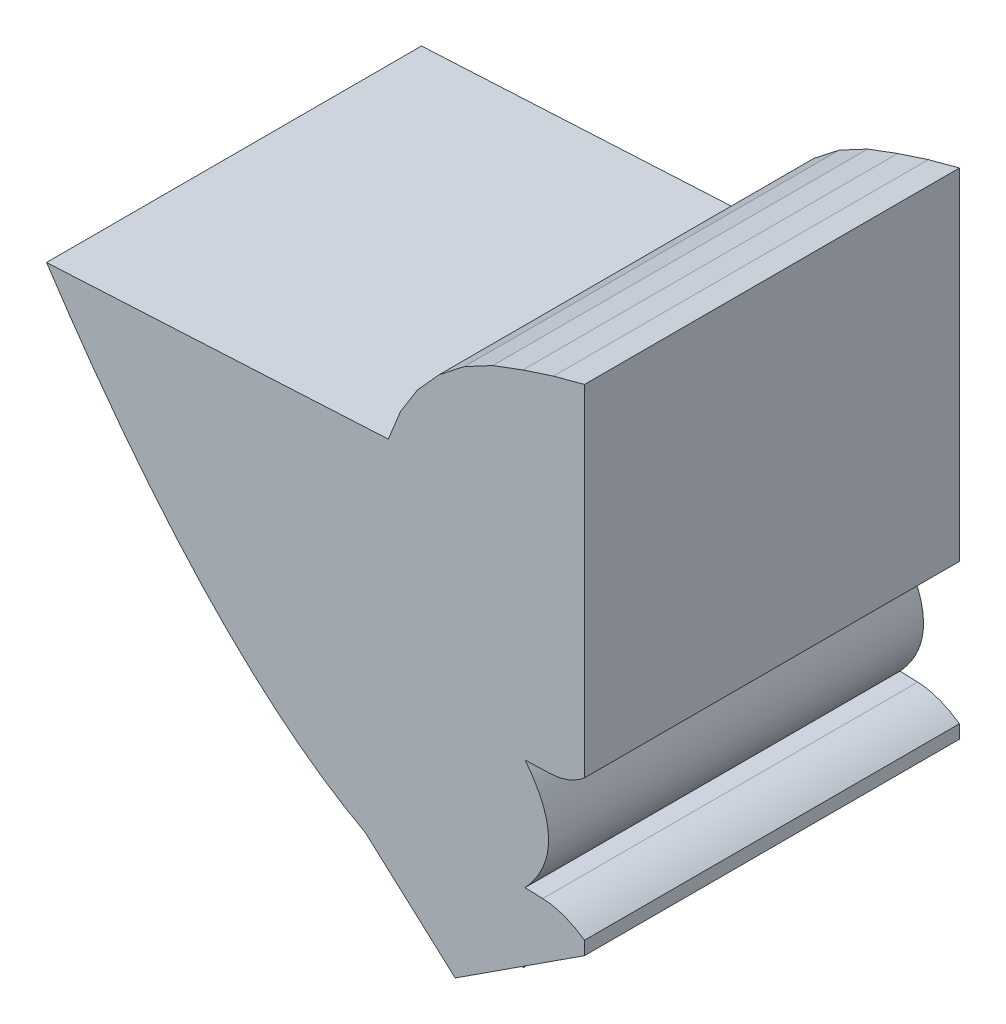
ISO-10303-21;
HEADER;
FILE_DESCRIPTION(('STEP AP214'),'2;1');
FILE_NAME('part.step','',(''),(''),'','','');
FILE_SCHEMA(('AUTOMOTIVE_DESIGN { 1 0 10303 214 1 1 1 1 }'));
ENDSEC;
DATA;
#1=APPLICATION_CONTEXT('core data for automotive mechanical design processes');
#2=APPLICATION_PROTOCOL_DEFINITION('international standard','automotive_design',2000,#1);
#3=PRODUCT_CONTEXT('',#1,'mechanical');
#4=PRODUCT('Part','Part','',(#3));
#5=PRODUCT_RELATED_PRODUCT_CATEGORY('part','',(#4));
#6=PRODUCT_DEFINITION_FORMATION('','',#4);
#7=PRODUCT_DEFINITION_CONTEXT('part definition',#1,'design');
#8=PRODUCT_DEFINITION('design','',#6,#7);
#9=PRODUCT_DEFINITION_SHAPE('','',#8);
#10=(LENGTH_UNIT() NAMED_UNIT(*) SI_UNIT(.MILLI.,.METRE.));
#11=(NAMED_UNIT(*) PLANE_ANGLE_UNIT() SI_UNIT($,.RADIAN.));
#12=(NAMED_UNIT(*) SI_UNIT($,.STERADIAN.) SOLID_ANGLE_UNIT());
#13=UNCERTAINTY_MEASURE_WITH_UNIT(LENGTH_MEASURE(1.E-05),#10,'distance_accuracy_value','');
#14=(GEOMETRIC_REPRESENTATION_CONTEXT(3) GLOBAL_UNCERTAINTY_ASSIGNED_CONTEXT((#13)) GLOBAL_UNIT_ASSIGNED_CONTEXT((#10,
#11,#12)) REPRESENTATION_CONTEXT('',''));
#15=CARTESIAN_POINT('',(0.,0.,0.));
#16=DIRECTION('',(0.,0.,1.));
#17=DIRECTION('',(1.,0.,0.));
#18=AXIS2_PLACEMENT_3D('',#15,#16,#17);
#19=CARTESIAN_POINT('',(-996004.99942647,89338.2959789018,30.7968303069805));
#20=CARTESIAN_POINT('',(996193.448091746,-87155.7427476542,30.7968303069805));
#21=CARTESIAN_POINT('',(-996386.896757022,84973.1895164066,30.7968303069805));
#22=B_SPLINE_CURVE_WITH_KNOTS('',2,(#19,#20,#21),.UNSPECIFIED.,.F.,.F.,(3,3),(0.,1.),.UNSPECIFIED.);
#23=DIRECTION('',(0.,0.,-1.));
#24=VECTOR('',#23,1.);
#25=SURFACE_OF_LINEAR_EXTRUSION('',#22,#24);
#26=CARTESIAN_POINT('',(-996004.99942647,89338.2959789018,6.9937));
#27=CARTESIAN_POINT('',(996193.448091746,-87155.7427476542,6.9937));
#28=CARTESIAN_POINT('',(-996386.896757022,84973.1895164066,6.9937));
#29=B_SPLINE_CURVE_WITH_KNOTS('',2,(#26,#27,#28),.UNSPECIFIED.,.F.,.F.,(3,3),(0.,1.),.UNSPECIFIED.);
#30=CARTESIAN_POINT('',(-2.11351559756429,2.34471545593529,6.9937));
#31=VERTEX_POINT('',#30);
#32=CARTESIAN_POINT('',(-2.11897326832641,-1.77801919491,6.9937));
#33=VERTEX_POINT('',#32);
#34=EDGE_CURVE('E321',#31,#33,#29,.T.);
#35=ORIENTED_EDGE('',*,*,#34,.T.);
#36=DIRECTION('',(0.,0.,-1.));
#37=VECTOR('',#36,1.);
#38=CARTESIAN_POINT('',(-2.11897326731891,-1.77801919494525,0.));
#39=LINE('',#38,#37);
#40=CARTESIAN_POINT('',(-2.11897326832641,-1.77801919491,-6.9937));
#41=VERTEX_POINT('',#40);
#42=EDGE_CURVE('E522',#33,#41,#39,.T.);
#43=ORIENTED_EDGE('',*,*,#42,.T.);
#44=CARTESIAN_POINT('',(-996004.99942647,89338.2959789018,-6.9937));
#45=CARTESIAN_POINT('',(996193.448091746,-87155.7427476542,-6.9937));
#46=CARTESIAN_POINT('',(-996386.896757022,84973.1895164066,-6.9937));
#47=B_SPLINE_CURVE_WITH_KNOTS('',2,(#44,#45,#46),.UNSPECIFIED.,.F.,.F.,(3,3),(0.,1.),.UNSPECIFIED.);
#48=CARTESIAN_POINT('',(-2.11351559802885,2.3447154697661,-6.9937));
#49=VERTEX_POINT('',#48);
#50=EDGE_CURVE('E213',#41,#49,#47,.F.);
#51=ORIENTED_EDGE('',*,*,#50,.T.);
#52=DIRECTION('',(0.,0.,-1.));
#53=VECTOR('',#52,1.);
#54=CARTESIAN_POINT('',(-2.11351560820955,2.34471546941639,0.));
#55=LINE('',#54,#53);
#56=EDGE_CURVE('E479',#49,#31,#55,.F.);
#57=ORIENTED_EDGE('',*,*,#56,.T.);
#58=EDGE_LOOP('',(#35,#43,#51,#57));
#59=FACE_BOUND('',#58,.T.);
#60=ADVANCED_FACE('F59',(#59),#25,.T.);
#61=CARTESIAN_POINT('',(-2.17733041778456,0.,6.9937));
#62=DIRECTION('',(1.,0.,0.));
#63=DIRECTION('',(0.,1.,0.));
#64=AXIS2_PLACEMENT_3D('',#61,#62,#63);
#65=PLANE('',#64);
#66=DIRECTION('',(0.,-1.,0.));
#67=VECTOR('',#66,1.);
#68=CARTESIAN_POINT('',(-2.17733041778456,0.,-6.9937));
#69=LINE('',#68,#67);
#70=CARTESIAN_POINT('',(-2.17733041778456,-4.34672273486103,-6.9937));
#71=VERTEX_POINT('',#70);
#72=CARTESIAN_POINT('',(-2.17733041780011,-4.38828202201252,-6.9937));
#73=VERTEX_POINT('',#72);
#74=EDGE_CURVE('E333',#71,#73,#69,.T.);
#75=ORIENTED_EDGE('',*,*,#74,.F.);
#76=DIRECTION('',(0.,0.,1.));
#77=VECTOR('',#76,1.);
#78=CARTESIAN_POINT('',(-2.17733041778456,-4.34672273486103,6.9937));
#79=LINE('',#78,#77);
#80=CARTESIAN_POINT('',(-2.17733041778456,-4.34672273486103,6.9937));
#81=VERTEX_POINT('',#80);
#82=EDGE_CURVE('E244',#71,#81,#79,.T.);
#83=ORIENTED_EDGE('',*,*,#82,.T.);
#84=DIRECTION('',(0.,-1.,0.));
#85=VECTOR('',#84,1.);
#86=CARTESIAN_POINT('',(-2.17733041778456,0.,6.9937));
#87=LINE('',#86,#85);
#88=CARTESIAN_POINT('',(-2.17733041778456,-4.38828202201252,6.9937));
#89=VERTEX_POINT('',#88);
#90=EDGE_CURVE('E482',#81,#89,#87,.T.);
#91=ORIENTED_EDGE('',*,*,#90,.T.);
#92=DIRECTION('',(0.,0.,1.));
#93=VECTOR('',#92,1.);
#94=CARTESIAN_POINT('',(-2.17733041780011,-4.38828202201252,-6.9937));
#95=LINE('',#94,#93);
#96=EDGE_CURVE('E310',#73,#89,#95,.T.);
#97=ORIENTED_EDGE('',*,*,#96,.F.);
#98=EDGE_LOOP('',(#75,#83,#91,#97));
#99=FACE_BOUND('',#98,.T.);
#100=ADVANCED_FACE('F58',(#99),#65,.T.);
#101=CARTESIAN_POINT('',(-82931.2998220372,996560.090302793,30.7968303069805));
#102=CARTESIAN_POINT('',(87153.689514863,-996199.076380996,30.7968303069805));
#103=CARTESIAN_POINT('',(-91384.2921388703,995820.549302198,30.7968303069805));
#104=B_SPLINE_CURVE_WITH_KNOTS('',2,(#101,#102,#103),.UNSPECIFIED.,.F.,.F.,(3,3),(0.,1.),.UNSPECIFIED.);
#105=DIRECTION('',(0.,0.,-1.));
#106=VECTOR('',#105,1.);
#107=SURFACE_OF_LINEAR_EXTRUSION('',#104,#106);
#108=CARTESIAN_POINT('',(-82931.2998220372,996560.090302793,-6.9937));
#109=CARTESIAN_POINT('',(87153.689514863,-996199.076380996,-6.9937));
#110=CARTESIAN_POINT('',(-91384.2921388703,995820.549302198,-6.9937));
#111=B_SPLINE_CURVE_WITH_KNOTS('',2,(#108,#109,#110),.UNSPECIFIED.,.F.,.F.,(3,3),(0.,1.),.UNSPECIFIED.);
#112=CARTESIAN_POINT('',(-19.9693590135837,9.49376503209609,-6.9937));
#113=VERTEX_POINT('',#112);
#114=CARTESIAN_POINT('',(-8.08311431531605,-2.9746782819303,-6.9937));
#115=VERTEX_POINT('',#114);
#116=EDGE_CURVE('E317',#113,#115,#111,.F.);
#117=ORIENTED_EDGE('',*,*,#116,.T.);
#118=DIRECTION('',(0.,0.,-1.));
#119=VECTOR('',#118,1.);
#120=CARTESIAN_POINT('',(-8.08311437413045,-2.97467822900344,0.));
#121=LINE('',#120,#119);
#122=CARTESIAN_POINT('',(-8.08311431532102,-2.97467828192582,6.9937));
#123=VERTEX_POINT('',#122);
#124=EDGE_CURVE('E13',#115,#123,#121,.F.);
#125=ORIENTED_EDGE('',*,*,#124,.T.);
#126=CARTESIAN_POINT('',(-82931.2998220372,996560.090302793,6.9937));
#127=CARTESIAN_POINT('',(87153.689514863,-996199.076380996,6.9937));
#128=CARTESIAN_POINT('',(-91384.2921388703,995820.549302198,6.9937));
#129=B_SPLINE_CURVE_WITH_KNOTS('',2,(#126,#127,#128),.UNSPECIFIED.,.F.,.F.,(3,3),(0.,1.),.UNSPECIFIED.);
#130=CARTESIAN_POINT('',(-19.9693590135837,9.49376503209609,6.9937));
#131=VERTEX_POINT('',#130);
#132=EDGE_CURVE('E332',#123,#131,#129,.T.);
#133=ORIENTED_EDGE('',*,*,#132,.T.);
#134=DIRECTION('',(0.,0.,1.));
#135=VECTOR('',#134,1.);
#136=CARTESIAN_POINT('',(-19.9693590135837,9.49376503209609,-6.9937));
#137=LINE('',#136,#135);
#138=EDGE_CURVE('E306',#113,#131,#137,.T.);
#139=ORIENTED_EDGE('',*,*,#138,.F.);
#140=EDGE_LOOP('',(#117,#125,#133,#139));
#141=FACE_BOUND('',#140,.T.);
#142=ADVANCED_FACE('F357',(#141),#107,.T.);
#143=CARTESIAN_POINT('',(-2.24900276093089,-4.39326729872251,6.9937));
#144=VERTEX_POINT('',#143);
#145=EDGE_CURVE('E323',#89,#144,#129,.T.);
#146=ORIENTED_EDGE('',*,*,#145,.T.);
#147=DIRECTION('',(0.,0.,-1.));
#148=VECTOR('',#147,1.);
#149=CARTESIAN_POINT('',(-2.24900276093298,-4.39326729870432,0.));
#150=LINE('',#149,#148);
#151=CARTESIAN_POINT('',(-2.24900276094009,-4.39326729870447,-6.9937));
#152=VERTEX_POINT('',#151);
#153=EDGE_CURVE('E67',#144,#152,#150,.T.);
#154=ORIENTED_EDGE('',*,*,#153,.T.);
#155=EDGE_CURVE('E314',#152,#73,#111,.F.);
#156=ORIENTED_EDGE('',*,*,#155,.T.);
#157=ORIENTED_EDGE('',*,*,#96,.T.);
#158=EDGE_LOOP('',(#146,#154,#156,#157));
#159=FACE_BOUND('',#158,.T.);
#160=ADVANCED_FACE('F363',(#159),#107,.T.);
#161=CARTESIAN_POINT('',(0.,0.,6.9937));
#162=DIRECTION('',(0.,0.,1.));
#163=DIRECTION('',(1.,0.,0.));
#164=AXIS2_PLACEMENT_3D('',#161,#162,#163);
#165=PLANE('',#164);
#166=ORIENTED_EDGE('',*,*,#90,.F.);
#167=DIRECTION('',(0.838670567945421,0.544639035015032,0.));
#168=VECTOR('',#167,1.);
#169=CARTESIAN_POINT('',(0.100000000004221,-2.86780706932932,6.9937));
#170=LINE('',#169,#168);
#171=CARTESIAN_POINT('',(0.100000000004221,-2.86780706932932,6.9937));
#172=VERTEX_POINT('',#171);
#173=EDGE_CURVE('E73',#81,#172,#170,.T.);
#174=ORIENTED_EDGE('',*,*,#173,.T.);
#175=DIRECTION('',(8.61615466474804E-13,1.,0.));
#176=VECTOR('',#175,1.);
#177=CARTESIAN_POINT('',(0.100000000004652,-2.36780706932965,6.9937));
#178=LINE('',#177,#176);
#179=CARTESIAN_POINT('',(0.100000000004652,-2.36780706932965,6.9937));
#180=VERTEX_POINT('',#179);
#181=EDGE_CURVE('E254',#172,#180,#178,.T.);
#182=ORIENTED_EDGE('',*,*,#181,.T.);
#183=CARTESIAN_POINT('',(-15263.34989045,-999887.731463145,6.9937));
#184=CARTESIAN_POINT('',(17450.9064372768,999845.895156391,6.9937));
#185=CARTESIAN_POINT('',(-19644.4629841036,-999811.258849637,6.9937));
#186=B_SPLINE_CURVE_WITH_KNOTS('',2,(#183,#184,#185),.UNSPECIFIED.,.F.,.F.,(3,3),(0.,1.),.UNSPECIFIED.);
#187=CARTESIAN_POINT('',(-1.45812060541251,-1.80109667841963,6.9937));
#188=VERTEX_POINT('',#187);
#189=EDGE_CURVE('E248',#180,#188,#186,.T.);
#190=ORIENTED_EDGE('',*,*,#189,.T.);
#191=DIRECTION('',(-0.999390827019096,0.0348994967025039,0.));
#192=VECTOR('',#191,1.);
#193=CARTESIAN_POINT('',(-1.45812060541251,-1.80109667841963,6.9937));
#194=LINE('',#193,#192);
#195=EDGE_CURVE('E224',#188,#33,#194,.T.);
#196=ORIENTED_EDGE('',*,*,#195,.T.);
#197=ORIENTED_EDGE('',*,*,#34,.F.);
#198=DIRECTION('',(0.999390827019096,0.0348994967025048,0.));
#199=VECTOR('',#198,1.);
#200=CARTESIAN_POINT('',(-2.17733041778456,2.34248700715526,6.9937));
#201=LINE('',#200,#199);
#202=CARTESIAN_POINT('',(-1.19050164048462,2.37694782742692,6.9937));
#203=VERTEX_POINT('',#202);
#204=EDGE_CURVE('E401',#31,#203,#201,.T.);
#205=ORIENTED_EDGE('',*,*,#204,.T.);
#206=CARTESIAN_POINT('',(-343900.072311573,939011.080499257,6.9937));
#207=CARTESIAN_POINT('',(342019.599581338,-939690.120785908,6.9937));
#208=CARTESIAN_POINT('',(-340141.301828429,940379.16107256,6.9937));
#209=B_SPLINE_CURVE_WITH_KNOTS('',2,(#206,#207,#208),.UNSPECIFIED.,.F.,.F.,(3,3),(0.,1.),.UNSPECIFIED.);
#210=CARTESIAN_POINT('',(0.100000000004221,2.87767341815847,6.9937));
#211=VERTEX_POINT('',#210);
#212=EDGE_CURVE('E303',#203,#211,#209,.T.);
#213=ORIENTED_EDGE('',*,*,#212,.T.);
#214=DIRECTION('',(0.,1.,0.));
#215=VECTOR('',#214,1.);
#216=CARTESIAN_POINT('',(0.100000000004221,2.87767341815847,6.9937));
#217=LINE('',#216,#215);
#218=CARTESIAN_POINT('',(0.100000000004747,15.587903347272,6.9937));
#219=VERTEX_POINT('',#218);
#220=EDGE_CURVE('E428',#211,#219,#217,.T.);
#221=ORIENTED_EDGE('',*,*,#220,.T.);
#222=DIRECTION('',(-0.96592582628907,-0.258819045102515,0.));
#223=VECTOR('',#222,1.);
#224=CARTESIAN_POINT('',(-1.05911099154214,15.277320493149,6.9937));
#225=LINE('',#224,#223);
#226=CARTESIAN_POINT('',(-1.05911099154214,15.277320493149,6.9937));
#227=VERTEX_POINT('',#226);
#228=EDGE_CURVE('E421',#219,#227,#225,.T.);
#229=ORIENTED_EDGE('',*,*,#228,.T.);
#230=DIRECTION('',(-0.951056516295155,-0.309016994374943,0.));
#231=VECTOR('',#230,1.);
#232=CARTESIAN_POINT('',(-2.20037881109632,14.906500099899,6.9937));
#233=LINE('',#232,#231);
#234=CARTESIAN_POINT('',(-2.20037881109632,14.906500099899,6.9937));
#235=VERTEX_POINT('',#234);
#236=EDGE_CURVE('E416',#227,#235,#233,.T.);
#237=ORIENTED_EDGE('',*,*,#236,.T.);
#238=DIRECTION('',(-0.9366721892484,-0.350207381259461,0.));
#239=VECTOR('',#238,1.);
#240=CARTESIAN_POINT('',(-3.3243854381944,14.4862512423877,6.9937));
#241=LINE('',#240,#239);
#242=CARTESIAN_POINT('',(-3.3243854381944,14.4862512423877,6.9937));
#243=VERTEX_POINT('',#242);
#244=EDGE_CURVE('E420',#235,#243,#241,.T.);
#245=ORIENTED_EDGE('',*,*,#244,.T.);
#246=DIRECTION('',(-0.882947592859007,-0.46947156278574,0.));
#247=VECTOR('',#246,1.);
#248=CARTESIAN_POINT('',(-4.38392254962521,13.9228853670448,6.9937));
#249=LINE('',#248,#247);
#250=CARTESIAN_POINT('',(-4.38392254962521,13.9228853670448,6.9937));
#251=VERTEX_POINT('',#250);
#252=EDGE_CURVE('E412',#243,#251,#249,.T.);
#253=ORIENTED_EDGE('',*,*,#252,.T.);
#254=DIRECTION('',(-0.788010753606726,-0.615661475325654,0.));
#255=VECTOR('',#254,1.);
#256=CARTESIAN_POINT('',(-5.32953545395328,13.184091596654,6.9937));
#257=LINE('',#256,#255);
#258=CARTESIAN_POINT('',(-5.32953545395328,13.184091596654,6.9937));
#259=VERTEX_POINT('',#258);
#260=EDGE_CURVE('E413',#251,#259,#257,.T.);
#261=ORIENTED_EDGE('',*,*,#260,.T.);
#262=DIRECTION('',(-0.669130606358526,-0.743144825477694,0.));
#263=VECTOR('',#262,1.);
#264=CARTESIAN_POINT('',(-6.13249218158351,12.2923178060808,6.9937));
#265=LINE('',#264,#263);
#266=CARTESIAN_POINT('',(-6.13249218158351,12.2923178060808,6.9937));
#267=VERTEX_POINT('',#266);
#268=EDGE_CURVE('E407',#259,#267,#265,.T.);
#269=ORIENTED_EDGE('',*,*,#268,.T.);
#270=DIRECTION('',(-0.52991926423321,-0.848048096156423,0.));
#271=VECTOR('',#270,1.);
#272=CARTESIAN_POINT('',(-6.76839529866336,11.2746600906931,6.9937));
#273=LINE('',#272,#271);
#274=CARTESIAN_POINT('',(-6.76839529866336,11.2746600906931,6.9937));
#275=VERTEX_POINT('',#274);
#276=EDGE_CURVE('E405',#267,#275,#273,.T.);
#277=ORIENTED_EDGE('',*,*,#276,.T.);
#278=DIRECTION('',(-0.374606593415918,-0.927183854566785,0.));
#279=VECTOR('',#278,1.);
#280=CARTESIAN_POINT('',(-7.21792321076246,10.1620394652129,6.9937));
#281=LINE('',#280,#279);
#282=CARTESIAN_POINT('',(-7.21792321076246,10.1620394652129,6.9937));
#283=VERTEX_POINT('',#282);
#284=EDGE_CURVE('E395',#275,#283,#281,.T.);
#285=ORIENTED_EDGE('',*,*,#284,.T.);
#286=DIRECTION('',(-0.998629534754487,-0.0523359562445909,0.));
#287=VECTOR('',#286,1.);
#288=CARTESIAN_POINT('',(-19.9693590135837,9.49376503209609,6.9937));
#289=LINE('',#288,#287);
#290=EDGE_CURVE('E298',#283,#131,#289,.T.);
#291=ORIENTED_EDGE('',*,*,#290,.T.);
#292=ORIENTED_EDGE('',*,*,#132,.F.);
#293=DIRECTION('',(0.743144825477401,-0.669130606358851,0.));
#294=VECTOR('',#293,1.);
#295=CARTESIAN_POINT('',(-9.70640562854601,-1.51306021842452,6.9937));
#296=LINE('',#295,#294);
#297=CARTESIAN_POINT('',(-4.72315415384322,-6.,6.9937));
#298=VERTEX_POINT('',#297);
#299=EDGE_CURVE('E246',#123,#298,#296,.T.);
#300=ORIENTED_EDGE('',*,*,#299,.T.);
#301=EDGE_CURVE('E245',#298,#144,#170,.T.);
#302=ORIENTED_EDGE('',*,*,#301,.T.);
#303=ORIENTED_EDGE('',*,*,#145,.F.);
#304=EDGE_LOOP('',(#166,#174,#182,#190,#196,#197,#205,#213,#221,#229,#237,#245,#253,#261,#269,
#277,#285,#291,#292,#300,#302,#303));
#305=FACE_BOUND('',#304,.T.);
#306=ADVANCED_FACE('F368',(#305),#165,.T.);
#307=CARTESIAN_POINT('',(0.,0.,-6.9937));
#308=DIRECTION('',(0.,0.,1.));
#309=DIRECTION('',(1.,0.,0.));
#310=AXIS2_PLACEMENT_3D('',#307,#308,#309);
#311=PLANE('',#310);
#312=ORIENTED_EDGE('',*,*,#50,.F.);
#313=DIRECTION('',(0.999390827019096,-0.0348994967025039,0.));
#314=VECTOR('',#313,1.);
#315=CARTESIAN_POINT('',(-1.45812060541251,-1.80109667841963,-6.9937));
#316=LINE('',#315,#314);
#317=CARTESIAN_POINT('',(-1.45812060541251,-1.80109667841963,-6.9937));
#318=VERTEX_POINT('',#317);
#319=EDGE_CURVE('E210',#41,#318,#316,.T.);
#320=ORIENTED_EDGE('',*,*,#319,.T.);
#321=CARTESIAN_POINT('',(-15263.34989045,-999887.731463145,-6.9937));
#322=CARTESIAN_POINT('',(17450.9064372768,999845.895156391,-6.9937));
#323=CARTESIAN_POINT('',(-19644.4629841036,-999811.258849637,-6.9937));
#324=B_SPLINE_CURVE_WITH_KNOTS('',2,(#321,#322,#323),.UNSPECIFIED.,.F.,.F.,(3,3),(0.,1.),.UNSPECIFIED.);
#325=CARTESIAN_POINT('',(0.100000000004652,-2.36780706932965,-6.9937));
#326=VERTEX_POINT('',#325);
#327=EDGE_CURVE('E214',#318,#326,#324,.F.);
#328=ORIENTED_EDGE('',*,*,#327,.T.);
#329=DIRECTION('',(-8.61615466474804E-13,-1.,0.));
#330=VECTOR('',#329,1.);
#331=CARTESIAN_POINT('',(0.100000000004652,-2.36780706932965,-6.9937));
#332=LINE('',#331,#330);
#333=CARTESIAN_POINT('',(0.100000000004221,-2.86780706932932,-6.9937));
#334=VERTEX_POINT('',#333);
#335=EDGE_CURVE('E233',#326,#334,#332,.T.);
#336=ORIENTED_EDGE('',*,*,#335,.T.);
#337=DIRECTION('',(-0.838670567945421,-0.544639035015032,0.));
#338=VECTOR('',#337,1.);
#339=CARTESIAN_POINT('',(0.100000000004221,-2.86780706932932,-6.9937));
#340=LINE('',#339,#338);
#341=EDGE_CURVE('E231',#334,#71,#340,.T.);
#342=ORIENTED_EDGE('',*,*,#341,.T.);
#343=ORIENTED_EDGE('',*,*,#74,.T.);
#344=ORIENTED_EDGE('',*,*,#155,.F.);
#345=CARTESIAN_POINT('',(-4.72315415384322,-6.,-6.9937));
#346=VERTEX_POINT('',#345);
#347=EDGE_CURVE('E82',#152,#346,#340,.T.);
#348=ORIENTED_EDGE('',*,*,#347,.T.);
#349=DIRECTION('',(-0.743144825477401,0.669130606358851,0.));
#350=VECTOR('',#349,1.);
#351=CARTESIAN_POINT('',(-9.70640562854601,-1.51306021842452,-6.9937));
#352=LINE('',#351,#350);
#353=EDGE_CURVE('E497',#346,#115,#352,.T.);
#354=ORIENTED_EDGE('',*,*,#353,.T.);
#355=ORIENTED_EDGE('',*,*,#116,.F.);
#356=DIRECTION('',(-0.998629534754487,-0.0523359562445909,0.));
#357=VECTOR('',#356,1.);
#358=CARTESIAN_POINT('',(-19.9693590135837,9.49376503209609,-6.9937));
#359=LINE('',#358,#357);
#360=CARTESIAN_POINT('',(-7.21792321076246,10.1620394652129,-6.9937));
#361=VERTEX_POINT('',#360);
#362=EDGE_CURVE('E305',#361,#113,#359,.T.);
#363=ORIENTED_EDGE('',*,*,#362,.F.);
#364=DIRECTION('',(0.374606593415918,0.927183854566785,0.));
#365=VECTOR('',#364,1.);
#366=CARTESIAN_POINT('',(-7.21792321076246,10.1620394652129,-6.9937));
#367=LINE('',#366,#365);
#368=CARTESIAN_POINT('',(-6.76839529866336,11.2746600906931,-6.9937));
#369=VERTEX_POINT('',#368);
#370=EDGE_CURVE('E391',#361,#369,#367,.T.);
#371=ORIENTED_EDGE('',*,*,#370,.T.);
#372=DIRECTION('',(0.52991926423321,0.848048096156423,0.));
#373=VECTOR('',#372,1.);
#374=CARTESIAN_POINT('',(-6.76839529866336,11.2746600906931,-6.9937));
#375=LINE('',#374,#373);
#376=CARTESIAN_POINT('',(-6.13249218158351,12.2923178060808,-6.9937));
#377=VERTEX_POINT('',#376);
#378=EDGE_CURVE('E502',#369,#377,#375,.T.);
#379=ORIENTED_EDGE('',*,*,#378,.T.);
#380=DIRECTION('',(0.669130606358526,0.743144825477694,0.));
#381=VECTOR('',#380,1.);
#382=CARTESIAN_POINT('',(-6.13249218158351,12.2923178060808,-6.9937));
#383=LINE('',#382,#381);
#384=CARTESIAN_POINT('',(-5.32953545395328,13.184091596654,-6.9937));
#385=VERTEX_POINT('',#384);
#386=EDGE_CURVE('E508',#377,#385,#383,.T.);
#387=ORIENTED_EDGE('',*,*,#386,.T.);
#388=DIRECTION('',(0.788010753606726,0.615661475325654,0.));
#389=VECTOR('',#388,1.);
#390=CARTESIAN_POINT('',(-5.32953545395328,13.184091596654,-6.9937));
#391=LINE('',#390,#389);
#392=CARTESIAN_POINT('',(-4.38392254962521,13.9228853670448,-6.9937));
#393=VERTEX_POINT('',#392);
#394=EDGE_CURVE('E512',#385,#393,#391,.T.);
#395=ORIENTED_EDGE('',*,*,#394,.T.);
#396=DIRECTION('',(0.882947592859007,0.46947156278574,0.));
#397=VECTOR('',#396,1.);
#398=CARTESIAN_POINT('',(-4.38392254962521,13.9228853670448,-6.9937));
#399=LINE('',#398,#397);
#400=CARTESIAN_POINT('',(-3.3243854381944,14.4862512423877,-6.9937));
#401=VERTEX_POINT('',#400);
#402=EDGE_CURVE('E517',#393,#401,#399,.T.);
#403=ORIENTED_EDGE('',*,*,#402,.T.);
#404=DIRECTION('',(0.9366721892484,0.350207381259461,0.));
#405=VECTOR('',#404,1.);
#406=CARTESIAN_POINT('',(-3.3243854381944,14.4862512423877,-6.9937));
#407=LINE('',#406,#405);
#408=CARTESIAN_POINT('',(-2.20037881109632,14.906500099899,-6.9937));
#409=VERTEX_POINT('',#408);
#410=EDGE_CURVE('E516',#401,#409,#407,.T.);
#411=ORIENTED_EDGE('',*,*,#410,.T.);
#412=DIRECTION('',(0.951056516295155,0.309016994374943,0.));
#413=VECTOR('',#412,1.);
#414=CARTESIAN_POINT('',(-2.20037881109632,14.906500099899,-6.9937));
#415=LINE('',#414,#413);
#416=CARTESIAN_POINT('',(-1.05911099154214,15.277320493149,-6.9937));
#417=VERTEX_POINT('',#416);
#418=EDGE_CURVE('E468',#409,#417,#415,.T.);
#419=ORIENTED_EDGE('',*,*,#418,.T.);
#420=DIRECTION('',(0.96592582628907,0.258819045102515,0.));
#421=VECTOR('',#420,1.);
#422=CARTESIAN_POINT('',(-1.05911099154214,15.277320493149,-6.9937));
#423=LINE('',#422,#421);
#424=CARTESIAN_POINT('',(0.100000000004747,15.587903347272,-6.9937));
#425=VERTEX_POINT('',#424);
#426=EDGE_CURVE('E457',#417,#425,#423,.T.);
#427=ORIENTED_EDGE('',*,*,#426,.T.);
#428=DIRECTION('',(0.,-1.,0.));
#429=VECTOR('',#428,1.);
#430=CARTESIAN_POINT('',(0.100000000004221,2.87767341815847,-6.9937));
#431=LINE('',#430,#429);
#432=CARTESIAN_POINT('',(0.0999999999995449,2.8776734181557,-6.9937));
#433=VERTEX_POINT('',#432);
#434=EDGE_CURVE('E447',#425,#433,#431,.T.);
#435=ORIENTED_EDGE('',*,*,#434,.T.);
#436=CARTESIAN_POINT('',(-343900.072311573,939011.080499257,-6.9937));
#437=CARTESIAN_POINT('',(342019.599581338,-939690.120785908,-6.9937));
#438=CARTESIAN_POINT('',(-340141.301828429,940379.16107256,-6.9937));
#439=B_SPLINE_CURVE_WITH_KNOTS('',2,(#436,#437,#438),.UNSPECIFIED.,.F.,.F.,(3,3),(0.,1.),.UNSPECIFIED.);
#440=CARTESIAN_POINT('',(-1.19050164048462,2.37694782741517,-6.9937));
#441=VERTEX_POINT('',#440);
#442=EDGE_CURVE('E454',#433,#441,#439,.F.);
#443=ORIENTED_EDGE('',*,*,#442,.T.);
#444=DIRECTION('',(-0.999390827019096,-0.0348994967025048,0.));
#445=VECTOR('',#444,1.);
#446=CARTESIAN_POINT('',(-2.17733041778456,2.34248700715526,-6.9937));
#447=LINE('',#446,#445);
#448=EDGE_CURVE('E459',#441,#49,#447,.T.);
#449=ORIENTED_EDGE('',*,*,#448,.T.);
#450=EDGE_LOOP('',(#312,#320,#328,#336,#342,#343,#344,#348,#354,#355,#363,#371,#379,#387,#395,
#403,#411,#419,#427,#435,#443,#449));
#451=FACE_BOUND('',#450,.T.);
#452=ADVANCED_FACE('F209',(#451),#311,.F.);
#453=CARTESIAN_POINT('',(-19.9693590135837,9.49376503209609,-6.9937));
#454=DIRECTION('',(-0.0523359562445909,0.998629534754487,0.));
#455=DIRECTION('',(-0.998629534754488,-0.052335956244591,0.));
#456=AXIS2_PLACEMENT_3D('',#453,#454,#455);
#457=PLANE('',#456);
#458=ORIENTED_EDGE('',*,*,#290,.F.);
#459=DIRECTION('',(0.,0.,-1.));
#460=VECTOR('',#459,1.);
#461=CARTESIAN_POINT('',(-7.21792321076246,10.1620394652129,23.8402253000013));
#462=LINE('',#461,#460);
#463=EDGE_CURVE('E383',#283,#361,#462,.T.);
#464=ORIENTED_EDGE('',*,*,#463,.T.);
#465=ORIENTED_EDGE('',*,*,#362,.T.);
#466=ORIENTED_EDGE('',*,*,#138,.T.);
#467=EDGE_LOOP('',(#458,#464,#465,#466));
#468=FACE_BOUND('',#467,.T.);
#469=ADVANCED_FACE('F361',(#468),#457,.T.);
#470=CARTESIAN_POINT('',(-1.05911099154214,15.277320493149,23.8402253000013));
#471=DIRECTION('',(0.258819045102515,-0.96592582628907,0.));
#472=DIRECTION('',(0.96592582628907,0.258819045102515,0.));
#473=AXIS2_PLACEMENT_3D('',#470,#471,#472);
#474=PLANE('',#473);
#475=ORIENTED_EDGE('',*,*,#228,.F.);
#476=DIRECTION('',(0.,0.,-1.));
#477=VECTOR('',#476,1.);
#478=CARTESIAN_POINT('',(0.100000000004747,15.587903347272,23.8402253000013));
#479=LINE('',#478,#477);
#480=EDGE_CURVE('E295',#219,#425,#479,.T.);
#481=ORIENTED_EDGE('',*,*,#480,.T.);
#482=ORIENTED_EDGE('',*,*,#426,.F.);
#483=DIRECTION('',(0.,0.,-1.));
#484=VECTOR('',#483,1.);
#485=CARTESIAN_POINT('',(-1.05911099154214,15.277320493149,23.8402253000013));
#486=LINE('',#485,#484);
#487=EDGE_CURVE('E427',#227,#417,#486,.T.);
#488=ORIENTED_EDGE('',*,*,#487,.F.);
#489=EDGE_LOOP('',(#475,#481,#482,#488));
#490=FACE_BOUND('',#489,.T.);
#491=ADVANCED_FACE('F376',(#490),#474,.F.);
#492=CARTESIAN_POINT('',(-2.20037881109632,14.906500099899,23.8402253000013));
#493=DIRECTION('',(0.309016994374943,-0.951056516295155,0.));
#494=DIRECTION('',(0.951056516295155,0.309016994374943,0.));
#495=AXIS2_PLACEMENT_3D('',#492,#493,#494);
#496=PLANE('',#495);
#497=ORIENTED_EDGE('',*,*,#236,.F.);
#498=ORIENTED_EDGE('',*,*,#487,.T.);
#499=ORIENTED_EDGE('',*,*,#418,.F.);
#500=DIRECTION('',(0.,0.,-1.));
#501=VECTOR('',#500,1.);
#502=CARTESIAN_POINT('',(-2.20037881109632,14.906500099899,23.8402253000013));
#503=LINE('',#502,#501);
#504=EDGE_CURVE('E435',#235,#409,#503,.T.);
#505=ORIENTED_EDGE('',*,*,#504,.F.);
#506=EDGE_LOOP('',(#497,#498,#499,#505));
#507=FACE_BOUND('',#506,.T.);
#508=ADVANCED_FACE('F382',(#507),#496,.F.);
#509=CARTESIAN_POINT('',(-3.3243854381944,14.4862512423877,23.8402253000013));
#510=DIRECTION('',(0.350207381259461,-0.9366721892484,0.));
#511=DIRECTION('',(0.9366721892484,0.350207381259461,0.));
#512=AXIS2_PLACEMENT_3D('',#509,#510,#511);
#513=PLANE('',#512);
#514=ORIENTED_EDGE('',*,*,#244,.F.);
#515=ORIENTED_EDGE('',*,*,#504,.T.);
#516=ORIENTED_EDGE('',*,*,#410,.F.);
#517=DIRECTION('',(0.,0.,-1.));
#518=VECTOR('',#517,1.);
#519=CARTESIAN_POINT('',(-3.3243854381944,14.4862512423877,23.8402253000013));
#520=LINE('',#519,#518);
#521=EDGE_CURVE('E432',#243,#401,#520,.T.);
#522=ORIENTED_EDGE('',*,*,#521,.F.);
#523=EDGE_LOOP('',(#514,#515,#516,#522));
#524=FACE_BOUND('',#523,.T.);
#525=ADVANCED_FACE('F650',(#524),#513,.F.);
#526=CARTESIAN_POINT('',(-4.38392254962521,13.9228853670448,23.8402253000013));
#527=DIRECTION('',(0.46947156278574,-0.882947592859007,0.));
#528=DIRECTION('',(0.882947592859007,0.46947156278574,0.));
#529=AXIS2_PLACEMENT_3D('',#526,#527,#528);
#530=PLANE('',#529);
#531=ORIENTED_EDGE('',*,*,#252,.F.);
#532=ORIENTED_EDGE('',*,*,#521,.T.);
#533=ORIENTED_EDGE('',*,*,#402,.F.);
#534=DIRECTION('',(0.,0.,-1.));
#535=VECTOR('',#534,1.);
#536=CARTESIAN_POINT('',(-4.38392254962521,13.9228853670448,23.8402253000013));
#537=LINE('',#536,#535);
#538=EDGE_CURVE('E436',#251,#393,#537,.T.);
#539=ORIENTED_EDGE('',*,*,#538,.F.);
#540=EDGE_LOOP('',(#531,#532,#533,#539));
#541=FACE_BOUND('',#540,.T.);
#542=ADVANCED_FACE('F638',(#541),#530,.F.);
#543=CARTESIAN_POINT('',(-5.32953545395328,13.184091596654,23.8402253000013));
#544=DIRECTION('',(0.615661475325654,-0.788010753606726,0.));
#545=DIRECTION('',(0.788010753606726,0.615661475325654,0.));
#546=AXIS2_PLACEMENT_3D('',#543,#544,#545);
#547=PLANE('',#546);
#548=ORIENTED_EDGE('',*,*,#260,.F.);
#549=ORIENTED_EDGE('',*,*,#538,.T.);
#550=ORIENTED_EDGE('',*,*,#394,.F.);
#551=DIRECTION('',(0.,0.,-1.));
#552=VECTOR('',#551,1.);
#553=CARTESIAN_POINT('',(-5.32953545395328,13.184091596654,23.8402253000013));
#554=LINE('',#553,#552);
#555=EDGE_CURVE('E438',#259,#385,#554,.T.);
#556=ORIENTED_EDGE('',*,*,#555,.F.);
#557=EDGE_LOOP('',(#548,#549,#550,#556));
#558=FACE_BOUND('',#557,.T.);
#559=ADVANCED_FACE('F629',(#558),#547,.F.);
#560=CARTESIAN_POINT('',(-6.13249218158351,12.2923178060808,23.8402253000013));
#561=DIRECTION('',(0.743144825477694,-0.669130606358526,0.));
#562=DIRECTION('',(0.669130606358526,0.743144825477694,0.));
#563=AXIS2_PLACEMENT_3D('',#560,#561,#562);
#564=PLANE('',#563);
#565=ORIENTED_EDGE('',*,*,#268,.F.);
#566=ORIENTED_EDGE('',*,*,#555,.T.);
#567=ORIENTED_EDGE('',*,*,#386,.F.);
#568=DIRECTION('',(0.,0.,-1.));
#569=VECTOR('',#568,1.);
#570=CARTESIAN_POINT('',(-6.13249218158351,12.2923178060808,23.8402253000013));
#571=LINE('',#570,#569);
#572=EDGE_CURVE('E439',#267,#377,#571,.T.);
#573=ORIENTED_EDGE('',*,*,#572,.F.);
#574=EDGE_LOOP('',(#565,#566,#567,#573));
#575=FACE_BOUND('',#574,.T.);
#576=ADVANCED_FACE('F625',(#575),#564,.F.);
#577=CARTESIAN_POINT('',(-6.76839529866336,11.2746600906931,23.8402253000013));
#578=DIRECTION('',(0.848048096156423,-0.529919264233209,0.));
#579=DIRECTION('',(0.52991926423321,0.848048096156423,0.));
#580=AXIS2_PLACEMENT_3D('',#577,#578,#579);
#581=PLANE('',#580);
#582=ORIENTED_EDGE('',*,*,#276,.F.);
#583=ORIENTED_EDGE('',*,*,#572,.T.);
#584=ORIENTED_EDGE('',*,*,#378,.F.);
#585=DIRECTION('',(0.,0.,-1.));
#586=VECTOR('',#585,1.);
#587=CARTESIAN_POINT('',(-6.76839529866336,11.2746600906931,23.8402253000013));
#588=LINE('',#587,#586);
#589=EDGE_CURVE('E400',#275,#369,#588,.T.);
#590=ORIENTED_EDGE('',*,*,#589,.F.);
#591=EDGE_LOOP('',(#582,#583,#584,#590));
#592=FACE_BOUND('',#591,.T.);
#593=ADVANCED_FACE('F510',(#592),#581,.F.);
#594=CARTESIAN_POINT('',(-7.21792321076246,10.1620394652129,23.8402253000013));
#595=DIRECTION('',(0.927183854566785,-0.374606593415918,0.));
#596=DIRECTION('',(0.374606593415918,0.927183854566785,0.));
#597=AXIS2_PLACEMENT_3D('',#594,#595,#596);
#598=PLANE('',#597);
#599=ORIENTED_EDGE('',*,*,#284,.F.);
#600=ORIENTED_EDGE('',*,*,#589,.T.);
#601=ORIENTED_EDGE('',*,*,#370,.F.);
#602=ORIENTED_EDGE('',*,*,#463,.F.);
#603=EDGE_LOOP('',(#599,#600,#601,#602));
#604=FACE_BOUND('',#603,.T.);
#605=ADVANCED_FACE('F392',(#604),#598,.F.);
#606=CARTESIAN_POINT('',(-2.17733041778456,2.34248700715526,23.8402253000013));
#607=DIRECTION('',(-0.0348994967025048,0.999390827019096,0.));
#608=DIRECTION('',(-0.999390827019096,-0.0348994967025048,0.));
#609=AXIS2_PLACEMENT_3D('',#606,#607,#608);
#610=PLANE('',#609);
#611=ORIENTED_EDGE('',*,*,#56,.F.);
#612=ORIENTED_EDGE('',*,*,#448,.F.);
#613=DIRECTION('',(0.,0.,-1.));
#614=VECTOR('',#613,1.);
#615=CARTESIAN_POINT('',(-1.19050164048462,2.37694782742692,23.8402253000013));
#616=LINE('',#615,#614);
#617=EDGE_CURVE('E396',#203,#441,#616,.T.);
#618=ORIENTED_EDGE('',*,*,#617,.F.);
#619=ORIENTED_EDGE('',*,*,#204,.F.);
#620=EDGE_LOOP('',(#611,#612,#618,#619));
#621=FACE_BOUND('',#620,.T.);
#622=ADVANCED_FACE('F287',(#621),#610,.F.);
#623=CARTESIAN_POINT('',(-343900.072311573,939011.080499257,23.8402253000013));
#624=CARTESIAN_POINT('',(342019.599581338,-939690.120785908,23.8402253000013));
#625=CARTESIAN_POINT('',(-340141.301828429,940379.16107256,23.8402253000013));
#626=B_SPLINE_CURVE_WITH_KNOTS('',2,(#623,#624,#625),.UNSPECIFIED.,.F.,.F.,(3,3),(0.,1.),.UNSPECIFIED.);
#627=DIRECTION('',(0.,0.,-1.));
#628=VECTOR('',#627,1.);
#629=SURFACE_OF_LINEAR_EXTRUSION('',#626,#628);
#630=ORIENTED_EDGE('',*,*,#212,.F.);
#631=ORIENTED_EDGE('',*,*,#617,.T.);
#632=ORIENTED_EDGE('',*,*,#442,.F.);
#633=DIRECTION('',(0.,0.,-1.));
#634=VECTOR('',#633,1.);
#635=CARTESIAN_POINT('',(0.100000000004221,2.87767341815847,23.8402253000013));
#636=LINE('',#635,#634);
#637=EDGE_CURVE('E429',#211,#433,#636,.T.);
#638=ORIENTED_EDGE('',*,*,#637,.F.);
#639=EDGE_LOOP('',(#630,#631,#632,#638));
#640=FACE_BOUND('',#639,.T.);
#641=ADVANCED_FACE('F283',(#640),#629,.F.);
#642=CARTESIAN_POINT('',(0.100000000004221,2.87767341815847,23.8402253000013));
#643=DIRECTION('',(-1.,0.,0.));
#644=DIRECTION('',(0.,-1.,0.));
#645=AXIS2_PLACEMENT_3D('',#642,#643,#644);
#646=PLANE('',#645);
#647=ORIENTED_EDGE('',*,*,#220,.F.);
#648=ORIENTED_EDGE('',*,*,#637,.T.);
#649=ORIENTED_EDGE('',*,*,#434,.F.);
#650=ORIENTED_EDGE('',*,*,#480,.F.);
#651=EDGE_LOOP('',(#647,#648,#649,#650));
#652=FACE_BOUND('',#651,.T.);
#653=ADVANCED_FACE('F279',(#652),#646,.F.);
#654=CARTESIAN_POINT('',(0.100000000004221,-2.86780706932932,17.7778652414679));
#655=DIRECTION('',(-0.544639035015032,0.838670567945421,0.));
#656=DIRECTION('',(-0.838670567945421,-0.544639035015032,0.));
#657=AXIS2_PLACEMENT_3D('',#654,#655,#656);
#658=PLANE('',#657);
#659=ORIENTED_EDGE('',*,*,#153,.F.);
#660=ORIENTED_EDGE('',*,*,#301,.F.);
#661=DIRECTION('',(0.,0.,-1.));
#662=VECTOR('',#661,1.);
#663=CARTESIAN_POINT('',(-4.72315415384322,-6.,17.7778652414679));
#664=LINE('',#663,#662);
#665=EDGE_CURVE('E226',#298,#346,#664,.T.);
#666=ORIENTED_EDGE('',*,*,#665,.T.);
#667=ORIENTED_EDGE('',*,*,#347,.F.);
#668=EDGE_LOOP('',(#659,#660,#666,#667));
#669=FACE_BOUND('',#668,.T.);
#670=ADVANCED_FACE('F278',(#669),#658,.F.);
#671=CARTESIAN_POINT('',(-9.70640562854601,-1.51306021842452,17.7778652414679));
#672=DIRECTION('',(0.669130606358851,0.7431448254774,0.));
#673=DIRECTION('',(-0.743144825477401,0.669130606358851,0.));
#674=AXIS2_PLACEMENT_3D('',#671,#672,#673);
#675=PLANE('',#674);
#676=ORIENTED_EDGE('',*,*,#124,.F.);
#677=ORIENTED_EDGE('',*,*,#353,.F.);
#678=ORIENTED_EDGE('',*,*,#665,.F.);
#679=ORIENTED_EDGE('',*,*,#299,.F.);
#680=EDGE_LOOP('',(#676,#677,#678,#679));
#681=FACE_BOUND('',#680,.T.);
#682=ADVANCED_FACE('F500',(#681),#675,.F.);
#683=ORIENTED_EDGE('',*,*,#82,.F.);
#684=ORIENTED_EDGE('',*,*,#341,.F.);
#685=DIRECTION('',(0.,0.,-1.));
#686=VECTOR('',#685,1.);
#687=CARTESIAN_POINT('',(0.100000000004221,-2.86780706932932,17.7778652414679));
#688=LINE('',#687,#686);
#689=EDGE_CURVE('E260',#172,#334,#688,.T.);
#690=ORIENTED_EDGE('',*,*,#689,.F.);
#691=ORIENTED_EDGE('',*,*,#173,.F.);
#692=EDGE_LOOP('',(#683,#684,#690,#691));
#693=FACE_BOUND('',#692,.T.);
#694=ADVANCED_FACE('F273',(#693),#658,.F.);
#695=CARTESIAN_POINT('',(-15263.34989045,-999887.731463145,17.7778652414679));
#696=CARTESIAN_POINT('',(17450.9064372768,999845.895156391,17.7778652414679));
#697=CARTESIAN_POINT('',(-19644.4629841036,-999811.258849637,17.7778652414679));
#698=B_SPLINE_CURVE_WITH_KNOTS('',2,(#695,#696,#697),.UNSPECIFIED.,.F.,.F.,(3,3),(0.,1.),.UNSPECIFIED.);
#699=DIRECTION('',(0.,0.,-1.));
#700=VECTOR('',#699,1.);
#701=SURFACE_OF_LINEAR_EXTRUSION('',#698,#700);
#702=ORIENTED_EDGE('',*,*,#189,.F.);
#703=DIRECTION('',(0.,0.,-1.));
#704=VECTOR('',#703,1.);
#705=CARTESIAN_POINT('',(0.100000000004652,-2.36780706932965,17.7778652414679));
#706=LINE('',#705,#704);
#707=EDGE_CURVE('E216',#180,#326,#706,.T.);
#708=ORIENTED_EDGE('',*,*,#707,.T.);
#709=ORIENTED_EDGE('',*,*,#327,.F.);
#710=DIRECTION('',(0.,0.,-1.));
#711=VECTOR('',#710,1.);
#712=CARTESIAN_POINT('',(-1.45812060541251,-1.80109667841963,17.7778652414679));
#713=LINE('',#712,#711);
#714=EDGE_CURVE('E222',#188,#318,#713,.T.);
#715=ORIENTED_EDGE('',*,*,#714,.F.);
#716=EDGE_LOOP('',(#702,#708,#709,#715));
#717=FACE_BOUND('',#716,.T.);
#718=ADVANCED_FACE('F229',(#717),#701,.F.);
#719=CARTESIAN_POINT('',(-1.45812060541251,-1.80109667841963,17.7778652414679));
#720=DIRECTION('',(-0.0348994967025039,-0.999390827019096,0.));
#721=DIRECTION('',(0.999390827019096,-0.0348994967025039,0.));
#722=AXIS2_PLACEMENT_3D('',#719,#720,#721);
#723=PLANE('',#722);
#724=ORIENTED_EDGE('',*,*,#42,.F.);
#725=ORIENTED_EDGE('',*,*,#195,.F.);
#726=ORIENTED_EDGE('',*,*,#714,.T.);
#727=ORIENTED_EDGE('',*,*,#319,.F.);
#728=EDGE_LOOP('',(#724,#725,#726,#727));
#729=FACE_BOUND('',#728,.T.);
#730=ADVANCED_FACE('F225',(#729),#723,.F.);
#731=CARTESIAN_POINT('',(0.100000000004652,-2.36780706932965,17.7778652414679));
#732=DIRECTION('',(-1.,8.61615466474804E-13,0.));
#733=DIRECTION('',(-8.61615466474804E-13,-1.,0.));
#734=AXIS2_PLACEMENT_3D('',#731,#732,#733);
#735=PLANE('',#734);
#736=ORIENTED_EDGE('',*,*,#181,.F.);
#737=ORIENTED_EDGE('',*,*,#689,.T.);
#738=ORIENTED_EDGE('',*,*,#335,.F.);
#739=ORIENTED_EDGE('',*,*,#707,.F.);
#740=EDGE_LOOP('',(#736,#737,#738,#739));
#741=FACE_BOUND('',#740,.T.);
#742=ADVANCED_FACE('F524',(#741),#735,.F.);
#743=CLOSED_SHELL('',(#60,#100,#142,#160,#306,#452,#469,#491,#508,#525,#542,#559,#576,#593,#605,
#622,#641,#653,#670,#682,#694,#718,#730,#742));
#744=MANIFOLD_SOLID_BREP('B2',#743);
#745=ADVANCED_BREP_SHAPE_REPRESENTATION('',(#18,#744),#14);
#746=SHAPE_DEFINITION_REPRESENTATION(#9,#745);
ENDSEC;
END-ISO-10303-21;
